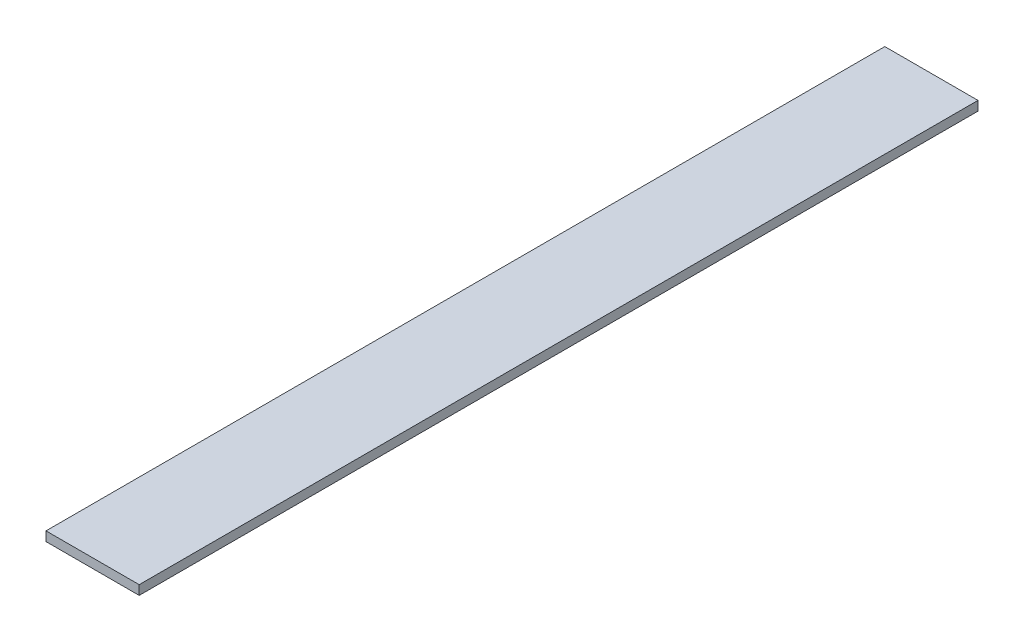
ISO-10303-21;
HEADER;
FILE_DESCRIPTION(('STEP AP214'),'2;1');
FILE_NAME('part.step','',(''),(''),'','','');
FILE_SCHEMA(('AUTOMOTIVE_DESIGN { 1 0 10303 214 1 1 1 1 }'));
ENDSEC;
DATA;
#1=APPLICATION_CONTEXT('core data for automotive mechanical design processes');
#2=APPLICATION_PROTOCOL_DEFINITION('international standard','automotive_design',2000,#1);
#3=PRODUCT_CONTEXT('',#1,'mechanical');
#4=PRODUCT('Part','Part','',(#3));
#5=PRODUCT_RELATED_PRODUCT_CATEGORY('part','',(#4));
#6=PRODUCT_DEFINITION_FORMATION('','',#4);
#7=PRODUCT_DEFINITION_CONTEXT('part definition',#1,'design');
#8=PRODUCT_DEFINITION('design','',#6,#7);
#9=PRODUCT_DEFINITION_SHAPE('','',#8);
#10=(LENGTH_UNIT() NAMED_UNIT(*) SI_UNIT(.MILLI.,.METRE.));
#11=(NAMED_UNIT(*) PLANE_ANGLE_UNIT() SI_UNIT($,.RADIAN.));
#12=(NAMED_UNIT(*) SI_UNIT($,.STERADIAN.) SOLID_ANGLE_UNIT());
#13=UNCERTAINTY_MEASURE_WITH_UNIT(LENGTH_MEASURE(1.E-05),#10,'distance_accuracy_value','');
#14=(GEOMETRIC_REPRESENTATION_CONTEXT(3) GLOBAL_UNCERTAINTY_ASSIGNED_CONTEXT((#13)) GLOBAL_UNIT_ASSIGNED_CONTEXT((#10,
#11,#12)) REPRESENTATION_CONTEXT('',''));
#15=CARTESIAN_POINT('',(0.,0.,0.));
#16=DIRECTION('',(0.,0.,1.));
#17=DIRECTION('',(1.,0.,0.));
#18=AXIS2_PLACEMENT_3D('',#15,#16,#17);
#19=CARTESIAN_POINT('',(-50.7999999999998,5.08,0.));
#20=DIRECTION('',(0.,0.,-1.));
#21=DIRECTION('',(-1.,0.,0.));
#22=AXIS2_PLACEMENT_3D('',#19,#20,#21);
#23=PLANE('',#22);
#24=DIRECTION('',(1.,0.,0.));
#25=VECTOR('',#24,1.);
#26=CARTESIAN_POINT('',(-50.7999999999998,0.,0.));
#27=LINE('',#26,#25);
#28=CARTESIAN_POINT('',(-50.7999999999998,0.,0.));
#29=VERTEX_POINT('',#28);
#30=CARTESIAN_POINT('',(0.,0.,0.));
#31=VERTEX_POINT('',#30);
#32=EDGE_CURVE('E104',#29,#31,#27,.T.);
#33=ORIENTED_EDGE('',*,*,#32,.T.);
#34=DIRECTION('',(0.,-1.,0.));
#35=VECTOR('',#34,1.);
#36=CARTESIAN_POINT('',(0.,5.08,0.));
#37=LINE('',#36,#35);
#38=CARTESIAN_POINT('',(0.,5.08,0.));
#39=VERTEX_POINT('',#38);
#40=EDGE_CURVE('E11',#39,#31,#37,.T.);
#41=ORIENTED_EDGE('',*,*,#40,.F.);
#42=DIRECTION('',(1.,0.,0.));
#43=VECTOR('',#42,1.);
#44=CARTESIAN_POINT('',(-50.7999999999998,5.08,0.));
#45=LINE('',#44,#43);
#46=CARTESIAN_POINT('',(-50.7999999999998,5.08,0.));
#47=VERTEX_POINT('',#46);
#48=EDGE_CURVE('E92',#47,#39,#45,.T.);
#49=ORIENTED_EDGE('',*,*,#48,.F.);
#50=DIRECTION('',(0.,-1.,0.));
#51=VECTOR('',#50,1.);
#52=CARTESIAN_POINT('',(-50.7999999999998,5.08,0.));
#53=LINE('',#52,#51);
#54=EDGE_CURVE('E100',#47,#29,#53,.T.);
#55=ORIENTED_EDGE('',*,*,#54,.T.);
#56=EDGE_LOOP('',(#33,#41,#49,#55));
#57=FACE_BOUND('',#56,.T.);
#58=ADVANCED_FACE('F41',(#57),#23,.F.);
#59=CARTESIAN_POINT('',(0.,5.08,0.));
#60=DIRECTION('',(-1.,0.,0.));
#61=DIRECTION('',(0.,0.,1.));
#62=AXIS2_PLACEMENT_3D('',#59,#60,#61);
#63=PLANE('',#62);
#64=DIRECTION('',(0.,0.,-1.));
#65=VECTOR('',#64,1.);
#66=CARTESIAN_POINT('',(0.,0.,0.));
#67=LINE('',#66,#65);
#68=CARTESIAN_POINT('',(0.,0.,-457.2));
#69=VERTEX_POINT('',#68);
#70=EDGE_CURVE('E96',#31,#69,#67,.T.);
#71=ORIENTED_EDGE('',*,*,#70,.T.);
#72=DIRECTION('',(0.,-1.,0.));
#73=VECTOR('',#72,1.);
#74=CARTESIAN_POINT('',(0.,5.08,-457.2));
#75=LINE('',#74,#73);
#76=CARTESIAN_POINT('',(0.,5.08,-457.2));
#77=VERTEX_POINT('',#76);
#78=EDGE_CURVE('E49',#77,#69,#75,.T.);
#79=ORIENTED_EDGE('',*,*,#78,.F.);
#80=DIRECTION('',(0.,0.,-1.));
#81=VECTOR('',#80,1.);
#82=CARTESIAN_POINT('',(0.,5.08,0.));
#83=LINE('',#82,#81);
#84=EDGE_CURVE('E87',#39,#77,#83,.T.);
#85=ORIENTED_EDGE('',*,*,#84,.F.);
#86=ORIENTED_EDGE('',*,*,#40,.T.);
#87=EDGE_LOOP('',(#71,#79,#85,#86));
#88=FACE_BOUND('',#87,.T.);
#89=ADVANCED_FACE('F95',(#88),#63,.F.);
#90=CARTESIAN_POINT('',(0.,5.08,-457.2));
#91=DIRECTION('',(0.,0.,1.));
#92=DIRECTION('',(1.,0.,0.));
#93=AXIS2_PLACEMENT_3D('',#90,#91,#92);
#94=PLANE('',#93);
#95=DIRECTION('',(-1.,0.,0.));
#96=VECTOR('',#95,1.);
#97=CARTESIAN_POINT('',(0.,0.,-457.2));
#98=LINE('',#97,#96);
#99=CARTESIAN_POINT('',(-50.8,0.,-457.2));
#100=VERTEX_POINT('',#99);
#101=EDGE_CURVE('E74',#69,#100,#98,.T.);
#102=ORIENTED_EDGE('',*,*,#101,.T.);
#103=DIRECTION('',(0.,-1.,0.));
#104=VECTOR('',#103,1.);
#105=CARTESIAN_POINT('',(-50.8,5.08,-457.2));
#106=LINE('',#105,#104);
#107=CARTESIAN_POINT('',(-50.8,5.08,-457.2));
#108=VERTEX_POINT('',#107);
#109=EDGE_CURVE('E97',#108,#100,#106,.T.);
#110=ORIENTED_EDGE('',*,*,#109,.F.);
#111=DIRECTION('',(-1.,0.,0.));
#112=VECTOR('',#111,1.);
#113=CARTESIAN_POINT('',(0.,5.08,-457.2));
#114=LINE('',#113,#112);
#115=EDGE_CURVE('E90',#77,#108,#114,.T.);
#116=ORIENTED_EDGE('',*,*,#115,.F.);
#117=ORIENTED_EDGE('',*,*,#78,.T.);
#118=EDGE_LOOP('',(#102,#110,#116,#117));
#119=FACE_BOUND('',#118,.T.);
#120=ADVANCED_FACE('F98',(#119),#94,.F.);
#121=CARTESIAN_POINT('',(-50.8,5.08,-457.2));
#122=DIRECTION('',(1.,0.,0.));
#123=DIRECTION('',(0.,0.,-1.));
#124=AXIS2_PLACEMENT_3D('',#121,#122,#123);
#125=PLANE('',#124);
#126=DIRECTION('',(0.,0.,1.));
#127=VECTOR('',#126,1.);
#128=CARTESIAN_POINT('',(-50.8,0.,-457.2));
#129=LINE('',#128,#127);
#130=EDGE_CURVE('E80',#100,#29,#129,.T.);
#131=ORIENTED_EDGE('',*,*,#130,.T.);
#132=ORIENTED_EDGE('',*,*,#54,.F.);
#133=DIRECTION('',(0.,0.,1.));
#134=VECTOR('',#133,1.);
#135=CARTESIAN_POINT('',(-50.8,5.08,-457.2));
#136=LINE('',#135,#134);
#137=EDGE_CURVE('E57',#108,#47,#136,.T.);
#138=ORIENTED_EDGE('',*,*,#137,.F.);
#139=ORIENTED_EDGE('',*,*,#109,.T.);
#140=EDGE_LOOP('',(#131,#132,#138,#139));
#141=FACE_BOUND('',#140,.T.);
#142=ADVANCED_FACE('F111',(#141),#125,.F.);
#143=CARTESIAN_POINT('',(0.,5.08,0.));
#144=DIRECTION('',(0.,1.,0.));
#145=DIRECTION('',(0.,0.,1.));
#146=AXIS2_PLACEMENT_3D('',#143,#144,#145);
#147=PLANE('',#146);
#148=ORIENTED_EDGE('',*,*,#48,.T.);
#149=ORIENTED_EDGE('',*,*,#84,.T.);
#150=ORIENTED_EDGE('',*,*,#115,.T.);
#151=ORIENTED_EDGE('',*,*,#137,.T.);
#152=EDGE_LOOP('',(#148,#149,#150,#151));
#153=FACE_BOUND('',#152,.T.);
#154=ADVANCED_FACE('F88',(#153),#147,.T.);
#155=CARTESIAN_POINT('',(0.,0.,0.));
#156=DIRECTION('',(0.,1.,0.));
#157=DIRECTION('',(0.,0.,1.));
#158=AXIS2_PLACEMENT_3D('',#155,#156,#157);
#159=PLANE('',#158);
#160=ORIENTED_EDGE('',*,*,#32,.F.);
#161=ORIENTED_EDGE('',*,*,#130,.F.);
#162=ORIENTED_EDGE('',*,*,#101,.F.);
#163=ORIENTED_EDGE('',*,*,#70,.F.);
#164=EDGE_LOOP('',(#160,#161,#162,#163));
#165=FACE_BOUND('',#164,.T.);
#166=ADVANCED_FACE('F114',(#165),#159,.F.);
#167=CLOSED_SHELL('',(#58,#89,#120,#142,#154,#166));
#168=MANIFOLD_SOLID_BREP('B2',#167);
#169=ADVANCED_BREP_SHAPE_REPRESENTATION('',(#18,#168),#14);
#170=SHAPE_DEFINITION_REPRESENTATION(#9,#169);
ENDSEC;
END-ISO-10303-21;
